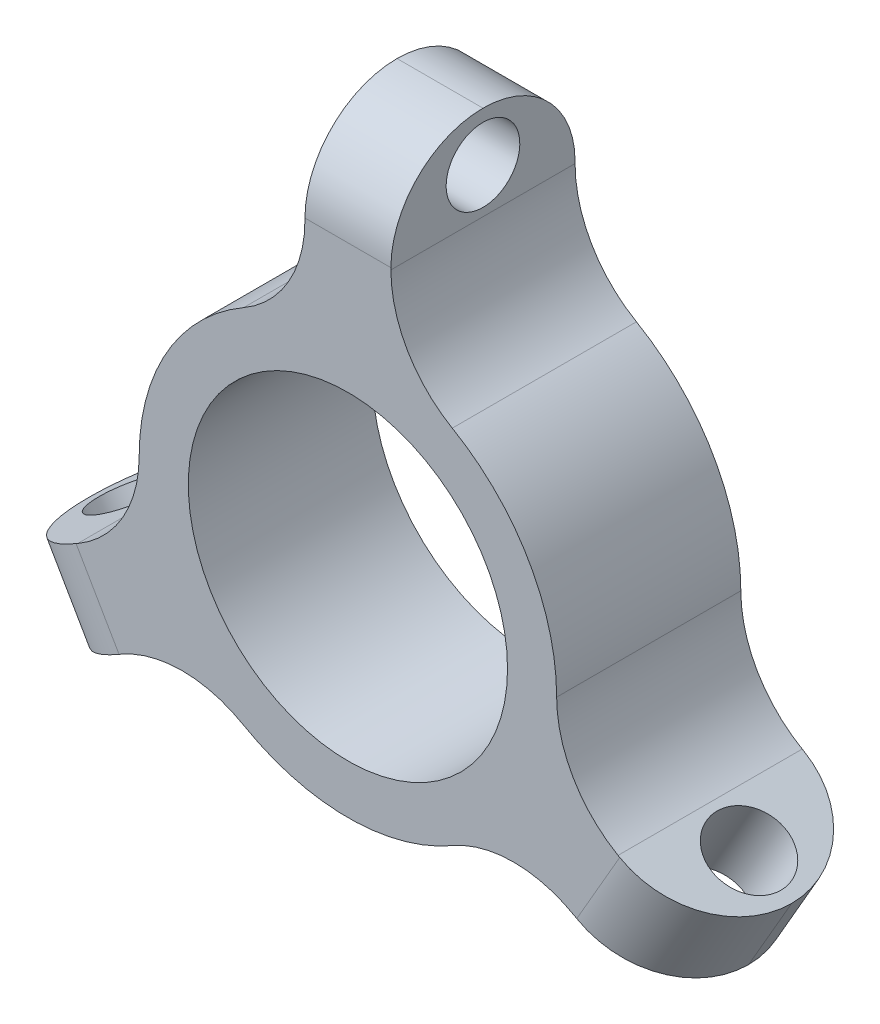
ISO-10303-21;
HEADER;
FILE_DESCRIPTION(('STEP AP214'),'2;1');
FILE_NAME('part.step','',(''),(''),'','','');
FILE_SCHEMA(('AUTOMOTIVE_DESIGN { 1 0 10303 214 1 1 1 1 }'));
ENDSEC;
DATA;
#1=APPLICATION_CONTEXT('core data for automotive mechanical design processes');
#2=APPLICATION_PROTOCOL_DEFINITION('international standard','automotive_design',2000,#1);
#3=PRODUCT_CONTEXT('',#1,'mechanical');
#4=PRODUCT('Part','Part','',(#3));
#5=PRODUCT_RELATED_PRODUCT_CATEGORY('part','',(#4));
#6=PRODUCT_DEFINITION_FORMATION('','',#4);
#7=PRODUCT_DEFINITION_CONTEXT('part definition',#1,'design');
#8=PRODUCT_DEFINITION('design','',#6,#7);
#9=PRODUCT_DEFINITION_SHAPE('','',#8);
#10=(LENGTH_UNIT() NAMED_UNIT(*) SI_UNIT(.MILLI.,.METRE.));
#11=(NAMED_UNIT(*) PLANE_ANGLE_UNIT() SI_UNIT($,.RADIAN.));
#12=(NAMED_UNIT(*) SI_UNIT($,.STERADIAN.) SOLID_ANGLE_UNIT());
#13=UNCERTAINTY_MEASURE_WITH_UNIT(LENGTH_MEASURE(1.E-05),#10,'distance_accuracy_value','');
#14=(GEOMETRIC_REPRESENTATION_CONTEXT(3) GLOBAL_UNCERTAINTY_ASSIGNED_CONTEXT((#13)) GLOBAL_UNIT_ASSIGNED_CONTEXT((#10,
#11,#12)) REPRESENTATION_CONTEXT('',''));
#15=CARTESIAN_POINT('',(0.,0.,0.));
#16=DIRECTION('',(0.,0.,1.));
#17=DIRECTION('',(1.,0.,0.));
#18=AXIS2_PLACEMENT_3D('',#15,#16,#17);
#19=CARTESIAN_POINT('',(-13.5,-23.3826859021798,15.));
#20=DIRECTION('',(0.,0.,1.));
#21=DIRECTION('',(1.,0.,0.));
#22=AXIS2_PLACEMENT_3D('',#19,#20,#21);
#23=PLANE('',#22);
#24=DIRECTION('',(-0.866025403784438,-0.5,0.));
#25=VECTOR('',#24,1.);
#26=CARTESIAN_POINT('',(-28.6324761614891,-12.4895159350739,15.));
#27=LINE('',#26,#25);
#28=CARTESIAN_POINT('',(-22.,-8.66025403784439,15.));
#29=VERTEX_POINT('',#28);
#30=CARTESIAN_POINT('',(-22.1372856331058,-8.73951593507389,15.));
#31=VERTEX_POINT('',#30);
#32=EDGE_CURVE('E259',#29,#31,#27,.T.);
#33=ORIENTED_EDGE('',*,*,#32,.T.);
#34=DIRECTION('',(0.5,-0.866025403784438,0.));
#35=VECTOR('',#34,1.);
#36=CARTESIAN_POINT('',(-18.6372856331058,-14.801693761565,15.));
#37=LINE('',#36,#35);
#38=CARTESIAN_POINT('',(-18.6372856331058,-14.801693761565,15.));
#39=VERTEX_POINT('',#38);
#40=EDGE_CURVE('E247',#31,#39,#37,.T.);
#41=ORIENTED_EDGE('',*,*,#40,.T.);
#42=DIRECTION('',(0.866025403784439,0.5,0.));
#43=VECTOR('',#42,1.);
#44=CARTESIAN_POINT('',(-18.5,-14.7224318643355,15.));
#45=LINE('',#44,#43);
#46=CARTESIAN_POINT('',(-18.5,-14.7224318643355,15.));
#47=VERTEX_POINT('',#46);
#48=EDGE_CURVE('E203',#39,#47,#45,.T.);
#49=ORIENTED_EDGE('',*,*,#48,.T.);
#50=CARTESIAN_POINT('',(-13.5,-23.3826859021798,15.));
#51=DIRECTION('',(0.,0.,-1.));
#52=DIRECTION('',(1.,0.,0.));
#53=AXIS2_PLACEMENT_3D('',#50,#51,#52);
#54=CIRCLE('',#53,10.);
#55=CARTESIAN_POINT('',(-8.49999999999999,-14.7224318643355,15.));
#56=VERTEX_POINT('',#55);
#57=EDGE_CURVE('E191',#47,#56,#54,.T.);
#58=ORIENTED_EDGE('',*,*,#57,.T.);
#59=CARTESIAN_POINT('',(0.,0.,15.));
#60=DIRECTION('',(0.,0.,1.));
#61=DIRECTION('',(1.,0.,0.));
#62=AXIS2_PLACEMENT_3D('',#59,#60,#61);
#63=CIRCLE('',#62,17.);
#64=CARTESIAN_POINT('',(8.49999999999999,-14.7224318643355,15.));
#65=VERTEX_POINT('',#64);
#66=EDGE_CURVE('E181',#56,#65,#63,.T.);
#67=ORIENTED_EDGE('',*,*,#66,.T.);
#68=CARTESIAN_POINT('',(13.5,-23.3826859021798,15.));
#69=DIRECTION('',(0.,0.,-1.));
#70=DIRECTION('',(1.,0.,0.));
#71=AXIS2_PLACEMENT_3D('',#68,#69,#70);
#72=CIRCLE('',#71,10.);
#73=CARTESIAN_POINT('',(18.5,-14.7224318643355,15.));
#74=VERTEX_POINT('',#73);
#75=EDGE_CURVE('E195',#65,#74,#72,.T.);
#76=ORIENTED_EDGE('',*,*,#75,.T.);
#77=DIRECTION('',(0.866025403784439,-0.5,0.));
#78=VECTOR('',#77,1.);
#79=CARTESIAN_POINT('',(25.1324761614891,-18.5516937615649,15.));
#80=LINE('',#79,#78);
#81=CARTESIAN_POINT('',(18.6372856331058,-14.8016937615649,15.));
#82=VERTEX_POINT('',#81);
#83=EDGE_CURVE('E286',#74,#82,#80,.T.);
#84=ORIENTED_EDGE('',*,*,#83,.T.);
#85=DIRECTION('',(0.5,0.866025403784439,0.));
#86=VECTOR('',#85,1.);
#87=CARTESIAN_POINT('',(22.1372856331058,-8.73951593507386,15.));
#88=LINE('',#87,#86);
#89=CARTESIAN_POINT('',(22.1372856331058,-8.73951593507386,15.));
#90=VERTEX_POINT('',#89);
#91=EDGE_CURVE('E243',#82,#90,#88,.T.);
#92=ORIENTED_EDGE('',*,*,#91,.T.);
#93=DIRECTION('',(-0.866025403784439,0.5,0.));
#94=VECTOR('',#93,1.);
#95=CARTESIAN_POINT('',(22.,-8.66025403784438,15.));
#96=LINE('',#95,#94);
#97=CARTESIAN_POINT('',(22.,-8.66025403784438,15.));
#98=VERTEX_POINT('',#97);
#99=EDGE_CURVE('E295',#90,#98,#96,.T.);
#100=ORIENTED_EDGE('',*,*,#99,.T.);
#101=CARTESIAN_POINT('',(27.,0.,15.));
#102=DIRECTION('',(0.,0.,-1.));
#103=DIRECTION('',(1.,0.,0.));
#104=AXIS2_PLACEMENT_3D('',#101,#102,#103);
#105=CIRCLE('',#104,10.);
#106=CARTESIAN_POINT('',(17.,0.,15.));
#107=VERTEX_POINT('',#106);
#108=EDGE_CURVE('E294',#98,#107,#105,.T.);
#109=ORIENTED_EDGE('',*,*,#108,.T.);
#110=CARTESIAN_POINT('',(0.,0.,15.));
#111=DIRECTION('',(0.,0.,1.));
#112=DIRECTION('',(1.,0.,0.));
#113=AXIS2_PLACEMENT_3D('',#110,#111,#112);
#114=CIRCLE('',#113,17.);
#115=CARTESIAN_POINT('',(8.5,14.7224318643355,15.));
#116=VERTEX_POINT('',#115);
#117=EDGE_CURVE('E296',#107,#116,#114,.T.);
#118=ORIENTED_EDGE('',*,*,#117,.T.);
#119=CARTESIAN_POINT('',(13.5,23.3826859021798,15.));
#120=DIRECTION('',(0.,0.,-1.));
#121=DIRECTION('',(1.,0.,0.));
#122=AXIS2_PLACEMENT_3D('',#119,#120,#121);
#123=CIRCLE('',#122,10.);
#124=CARTESIAN_POINT('',(3.5,23.3826859021798,15.));
#125=VERTEX_POINT('',#124);
#126=EDGE_CURVE('E299',#116,#125,#123,.T.);
#127=ORIENTED_EDGE('',*,*,#126,.T.);
#128=DIRECTION('',(0.,1.,0.));
#129=VECTOR('',#128,1.);
#130=CARTESIAN_POINT('',(3.5,31.0412096966388,15.));
#131=LINE('',#130,#129);
#132=CARTESIAN_POINT('',(3.5,23.5412096966388,15.));
#133=VERTEX_POINT('',#132);
#134=EDGE_CURVE('E300',#125,#133,#131,.T.);
#135=ORIENTED_EDGE('',*,*,#134,.T.);
#136=DIRECTION('',(-1.,0.,0.));
#137=VECTOR('',#136,1.);
#138=CARTESIAN_POINT('',(-3.5,23.5412096966388,15.));
#139=LINE('',#138,#137);
#140=CARTESIAN_POINT('',(-3.5,23.5412096966388,15.));
#141=VERTEX_POINT('',#140);
#142=EDGE_CURVE('E226',#133,#141,#139,.T.);
#143=ORIENTED_EDGE('',*,*,#142,.T.);
#144=DIRECTION('',(0.,-1.,0.));
#145=VECTOR('',#144,1.);
#146=CARTESIAN_POINT('',(-3.5,23.3826859021798,15.));
#147=LINE('',#146,#145);
#148=CARTESIAN_POINT('',(-3.5,23.3826859021798,15.));
#149=VERTEX_POINT('',#148);
#150=EDGE_CURVE('E305',#141,#149,#147,.T.);
#151=ORIENTED_EDGE('',*,*,#150,.T.);
#152=CARTESIAN_POINT('',(-13.5,23.3826859021798,15.));
#153=DIRECTION('',(0.,0.,-1.));
#154=DIRECTION('',(1.,0.,0.));
#155=AXIS2_PLACEMENT_3D('',#152,#153,#154);
#156=CIRCLE('',#155,10.);
#157=CARTESIAN_POINT('',(-8.5,14.7224318643355,15.));
#158=VERTEX_POINT('',#157);
#159=EDGE_CURVE('E303',#149,#158,#156,.T.);
#160=ORIENTED_EDGE('',*,*,#159,.T.);
#161=CARTESIAN_POINT('',(0.,0.,15.));
#162=DIRECTION('',(0.,0.,1.));
#163=DIRECTION('',(1.,0.,0.));
#164=AXIS2_PLACEMENT_3D('',#161,#162,#163);
#165=CIRCLE('',#164,17.);
#166=CARTESIAN_POINT('',(-17.,0.,15.));
#167=VERTEX_POINT('',#166);
#168=EDGE_CURVE('E307',#158,#167,#165,.T.);
#169=ORIENTED_EDGE('',*,*,#168,.T.);
#170=CARTESIAN_POINT('',(-27.,0.,15.));
#171=DIRECTION('',(0.,0.,-1.));
#172=DIRECTION('',(-1.,0.,0.));
#173=AXIS2_PLACEMENT_3D('',#170,#171,#172);
#174=CIRCLE('',#173,10.);
#175=EDGE_CURVE('E262',#167,#29,#174,.T.);
#176=ORIENTED_EDGE('',*,*,#175,.T.);
#177=EDGE_LOOP('',(#33,#41,#49,#58,#67,#76,#84,#92,#100,#109,#118,#127,#135,#143,#151,#160,#169,#176));
#178=FACE_BOUND('',#177,.T.);
#179=CARTESIAN_POINT('',(0.,0.,15.));
#180=DIRECTION('',(0.,0.,1.));
#181=DIRECTION('',(1.,0.,0.));
#182=AXIS2_PLACEMENT_3D('',#179,#180,#181);
#183=CIRCLE('',#182,13.);
#184=CARTESIAN_POINT('',(13.,0.,15.));
#185=VERTEX_POINT('',#184);
#186=EDGE_CURVE('E284',#185,#185,#183,.T.);
#187=ORIENTED_EDGE('',*,*,#186,.F.);
#188=EDGE_LOOP('',(#187));
#189=FACE_BOUND('',#188,.T.);
#190=ADVANCED_FACE('F39',(#178,#189),#23,.T.);
#191=CARTESIAN_POINT('',(-13.5,-23.3826859021798,0.));
#192=DIRECTION('',(0.,0.,1.));
#193=DIRECTION('',(1.,0.,0.));
#194=AXIS2_PLACEMENT_3D('',#191,#192,#193);
#195=PLANE('',#194);
#196=DIRECTION('',(0.866025403784439,0.5,0.));
#197=VECTOR('',#196,1.);
#198=CARTESIAN_POINT('',(-18.5,-14.7224318643355,0.));
#199=LINE('',#198,#197);
#200=CARTESIAN_POINT('',(-18.6372856331058,-14.801693761565,0.));
#201=VERTEX_POINT('',#200);
#202=CARTESIAN_POINT('',(-18.5,-14.7224318643355,0.));
#203=VERTEX_POINT('',#202);
#204=EDGE_CURVE('E202',#201,#203,#199,.T.);
#205=ORIENTED_EDGE('',*,*,#204,.F.);
#206=DIRECTION('',(0.5,-0.866025403784438,0.));
#207=VECTOR('',#206,1.);
#208=CARTESIAN_POINT('',(-13.6372856331058,-23.4619477994093,0.));
#209=LINE('',#208,#207);
#210=CARTESIAN_POINT('',(-22.1372856331058,-8.73951593507389,0.));
#211=VERTEX_POINT('',#210);
#212=EDGE_CURVE('E11',#201,#211,#209,.F.);
#213=ORIENTED_EDGE('',*,*,#212,.T.);
#214=DIRECTION('',(-0.866025403784438,-0.5,0.));
#215=VECTOR('',#214,1.);
#216=CARTESIAN_POINT('',(-28.6324761614891,-12.4895159350739,0.));
#217=LINE('',#216,#215);
#218=CARTESIAN_POINT('',(-22.,-8.66025403784439,0.));
#219=VERTEX_POINT('',#218);
#220=EDGE_CURVE('E338',#219,#211,#217,.T.);
#221=ORIENTED_EDGE('',*,*,#220,.F.);
#222=CARTESIAN_POINT('',(-27.,0.,0.));
#223=DIRECTION('',(0.,0.,-1.));
#224=DIRECTION('',(-1.,0.,0.));
#225=AXIS2_PLACEMENT_3D('',#222,#223,#224);
#226=CIRCLE('',#225,10.);
#227=CARTESIAN_POINT('',(-17.,0.,0.));
#228=VERTEX_POINT('',#227);
#229=EDGE_CURVE('E337',#228,#219,#226,.T.);
#230=ORIENTED_EDGE('',*,*,#229,.F.);
#231=CARTESIAN_POINT('',(0.,0.,0.));
#232=DIRECTION('',(0.,0.,1.));
#233=DIRECTION('',(1.,0.,0.));
#234=AXIS2_PLACEMENT_3D('',#231,#232,#233);
#235=CIRCLE('',#234,17.);
#236=CARTESIAN_POINT('',(-8.5,14.7224318643355,0.));
#237=VERTEX_POINT('',#236);
#238=EDGE_CURVE('E333',#237,#228,#235,.T.);
#239=ORIENTED_EDGE('',*,*,#238,.F.);
#240=CARTESIAN_POINT('',(-13.5,23.3826859021798,0.));
#241=DIRECTION('',(0.,0.,-1.));
#242=DIRECTION('',(1.,0.,0.));
#243=AXIS2_PLACEMENT_3D('',#240,#241,#242);
#244=CIRCLE('',#243,10.);
#245=CARTESIAN_POINT('',(-3.5,23.3826859021798,0.));
#246=VERTEX_POINT('',#245);
#247=EDGE_CURVE('E334',#246,#237,#244,.T.);
#248=ORIENTED_EDGE('',*,*,#247,.F.);
#249=DIRECTION('',(0.,-1.,0.));
#250=VECTOR('',#249,1.);
#251=CARTESIAN_POINT('',(-3.5,23.3826859021798,0.));
#252=LINE('',#251,#250);
#253=CARTESIAN_POINT('',(-3.5,23.5412096966388,0.));
#254=VERTEX_POINT('',#253);
#255=EDGE_CURVE('E332',#254,#246,#252,.T.);
#256=ORIENTED_EDGE('',*,*,#255,.F.);
#257=DIRECTION('',(-1.,0.,0.));
#258=VECTOR('',#257,1.);
#259=CARTESIAN_POINT('',(-13.5,23.5412096966388,0.));
#260=LINE('',#259,#258);
#261=CARTESIAN_POINT('',(3.5,23.5412096966388,0.));
#262=VERTEX_POINT('',#261);
#263=EDGE_CURVE('E218',#254,#262,#260,.F.);
#264=ORIENTED_EDGE('',*,*,#263,.T.);
#265=DIRECTION('',(0.,1.,0.));
#266=VECTOR('',#265,1.);
#267=CARTESIAN_POINT('',(3.5,31.0412096966388,0.));
#268=LINE('',#267,#266);
#269=CARTESIAN_POINT('',(3.5,23.3826859021798,0.));
#270=VERTEX_POINT('',#269);
#271=EDGE_CURVE('E327',#270,#262,#268,.T.);
#272=ORIENTED_EDGE('',*,*,#271,.F.);
#273=CARTESIAN_POINT('',(13.5,23.3826859021798,0.));
#274=DIRECTION('',(0.,0.,-1.));
#275=DIRECTION('',(1.,0.,0.));
#276=AXIS2_PLACEMENT_3D('',#273,#274,#275);
#277=CIRCLE('',#276,10.);
#278=CARTESIAN_POINT('',(8.5,14.7224318643355,0.));
#279=VERTEX_POINT('',#278);
#280=EDGE_CURVE('E326',#279,#270,#277,.T.);
#281=ORIENTED_EDGE('',*,*,#280,.F.);
#282=CARTESIAN_POINT('',(0.,0.,0.));
#283=DIRECTION('',(0.,0.,1.));
#284=DIRECTION('',(1.,0.,0.));
#285=AXIS2_PLACEMENT_3D('',#282,#283,#284);
#286=CIRCLE('',#285,17.);
#287=CARTESIAN_POINT('',(17.,0.,0.));
#288=VERTEX_POINT('',#287);
#289=EDGE_CURVE('E322',#288,#279,#286,.T.);
#290=ORIENTED_EDGE('',*,*,#289,.F.);
#291=CARTESIAN_POINT('',(27.,0.,0.));
#292=DIRECTION('',(0.,0.,-1.));
#293=DIRECTION('',(1.,0.,0.));
#294=AXIS2_PLACEMENT_3D('',#291,#292,#293);
#295=CIRCLE('',#294,10.);
#296=CARTESIAN_POINT('',(22.,-8.66025403784438,0.));
#297=VERTEX_POINT('',#296);
#298=EDGE_CURVE('E325',#297,#288,#295,.T.);
#299=ORIENTED_EDGE('',*,*,#298,.F.);
#300=DIRECTION('',(-0.866025403784439,0.5,0.));
#301=VECTOR('',#300,1.);
#302=CARTESIAN_POINT('',(22.,-8.66025403784438,0.));
#303=LINE('',#302,#301);
#304=CARTESIAN_POINT('',(22.1372856331058,-8.73951593507387,0.));
#305=VERTEX_POINT('',#304);
#306=EDGE_CURVE('E319',#305,#297,#303,.T.);
#307=ORIENTED_EDGE('',*,*,#306,.F.);
#308=DIRECTION('',(0.5,0.866025403784439,0.));
#309=VECTOR('',#308,1.);
#310=CARTESIAN_POINT('',(6.8872856331058,-35.1532907504993,0.));
#311=LINE('',#310,#309);
#312=CARTESIAN_POINT('',(18.6372856331058,-14.8016937615649,0.));
#313=VERTEX_POINT('',#312);
#314=EDGE_CURVE('E240',#305,#313,#311,.F.);
#315=ORIENTED_EDGE('',*,*,#314,.T.);
#316=DIRECTION('',(0.866025403784439,-0.5,0.));
#317=VECTOR('',#316,1.);
#318=CARTESIAN_POINT('',(25.1324761614891,-18.5516937615649,0.));
#319=LINE('',#318,#317);
#320=CARTESIAN_POINT('',(18.5,-14.7224318643355,0.));
#321=VERTEX_POINT('',#320);
#322=EDGE_CURVE('E320',#321,#313,#319,.T.);
#323=ORIENTED_EDGE('',*,*,#322,.F.);
#324=CARTESIAN_POINT('',(13.5,-23.3826859021798,0.));
#325=DIRECTION('',(0.,0.,-1.));
#326=DIRECTION('',(1.,0.,0.));
#327=AXIS2_PLACEMENT_3D('',#324,#325,#326);
#328=CIRCLE('',#327,10.);
#329=CARTESIAN_POINT('',(8.49999999999999,-14.7224318643355,0.));
#330=VERTEX_POINT('',#329);
#331=EDGE_CURVE('E312',#330,#321,#328,.T.);
#332=ORIENTED_EDGE('',*,*,#331,.F.);
#333=CARTESIAN_POINT('',(0.,0.,0.));
#334=DIRECTION('',(0.,0.,1.));
#335=DIRECTION('',(1.,0.,0.));
#336=AXIS2_PLACEMENT_3D('',#333,#334,#335);
#337=CIRCLE('',#336,17.);
#338=CARTESIAN_POINT('',(-8.49999999999999,-14.7224318643355,0.));
#339=VERTEX_POINT('',#338);
#340=EDGE_CURVE('E311',#339,#330,#337,.T.);
#341=ORIENTED_EDGE('',*,*,#340,.F.);
#342=CARTESIAN_POINT('',(-13.5,-23.3826859021798,0.));
#343=DIRECTION('',(0.,0.,-1.));
#344=DIRECTION('',(1.,0.,0.));
#345=AXIS2_PLACEMENT_3D('',#342,#343,#344);
#346=CIRCLE('',#345,10.);
#347=EDGE_CURVE('E207',#203,#339,#346,.T.);
#348=ORIENTED_EDGE('',*,*,#347,.F.);
#349=EDGE_LOOP('',(#205,#213,#221,#230,#239,#248,#256,#264,#272,#281,#290,#299,#307,#315,#323,
#332,#341,#348));
#350=FACE_BOUND('',#349,.T.);
#351=CARTESIAN_POINT('',(0.,0.,0.));
#352=DIRECTION('',(0.,0.,1.));
#353=DIRECTION('',(1.,0.,0.));
#354=AXIS2_PLACEMENT_3D('',#351,#352,#353);
#355=CIRCLE('',#354,13.);
#356=CARTESIAN_POINT('',(13.,0.,0.));
#357=VERTEX_POINT('',#356);
#358=EDGE_CURVE('E234',#357,#357,#355,.T.);
#359=ORIENTED_EDGE('',*,*,#358,.T.);
#360=EDGE_LOOP('',(#359));
#361=FACE_BOUND('',#360,.T.);
#362=ADVANCED_FACE('F373',(#350,#361),#195,.F.);
#363=CARTESIAN_POINT('',(-13.5,-23.3826859021798,15.));
#364=DIRECTION('',(0.,0.,-1.));
#365=DIRECTION('',(-1.,0.,0.));
#366=AXIS2_PLACEMENT_3D('',#363,#364,#365);
#367=CYLINDRICAL_SURFACE('',#366,10.);
#368=ORIENTED_EDGE('',*,*,#347,.T.);
#369=DIRECTION('',(0.,0.,-1.));
#370=VECTOR('',#369,1.);
#371=CARTESIAN_POINT('',(-8.49999999999999,-14.7224318643355,15.));
#372=LINE('',#371,#370);
#373=EDGE_CURVE('E187',#56,#339,#372,.T.);
#374=ORIENTED_EDGE('',*,*,#373,.F.);
#375=ORIENTED_EDGE('',*,*,#57,.F.);
#376=DIRECTION('',(0.,0.,-1.));
#377=VECTOR('',#376,1.);
#378=CARTESIAN_POINT('',(-18.5,-14.7224318643355,15.));
#379=LINE('',#378,#377);
#380=EDGE_CURVE('E313',#47,#203,#379,.T.);
#381=ORIENTED_EDGE('',*,*,#380,.T.);
#382=EDGE_LOOP('',(#368,#374,#375,#381));
#383=FACE_BOUND('',#382,.T.);
#384=ADVANCED_FACE('F210',(#383),#367,.F.);
#385=CARTESIAN_POINT('',(0.,0.,15.));
#386=DIRECTION('',(0.,0.,-1.));
#387=DIRECTION('',(-1.,0.,0.));
#388=AXIS2_PLACEMENT_3D('',#385,#386,#387);
#389=CYLINDRICAL_SURFACE('',#388,17.);
#390=ORIENTED_EDGE('',*,*,#340,.T.);
#391=DIRECTION('',(0.,0.,-1.));
#392=VECTOR('',#391,1.);
#393=CARTESIAN_POINT('',(8.49999999999999,-14.7224318643355,15.));
#394=LINE('',#393,#392);
#395=EDGE_CURVE('E190',#65,#330,#394,.T.);
#396=ORIENTED_EDGE('',*,*,#395,.F.);
#397=ORIENTED_EDGE('',*,*,#66,.F.);
#398=ORIENTED_EDGE('',*,*,#373,.T.);
#399=EDGE_LOOP('',(#390,#396,#397,#398));
#400=FACE_BOUND('',#399,.T.);
#401=ADVANCED_FACE('F183',(#400),#389,.T.);
#402=CARTESIAN_POINT('',(13.5,-23.3826859021798,15.));
#403=DIRECTION('',(0.,0.,-1.));
#404=DIRECTION('',(-1.,0.,0.));
#405=AXIS2_PLACEMENT_3D('',#402,#403,#404);
#406=CYLINDRICAL_SURFACE('',#405,10.);
#407=ORIENTED_EDGE('',*,*,#331,.T.);
#408=DIRECTION('',(0.,0.,-1.));
#409=VECTOR('',#408,1.);
#410=CARTESIAN_POINT('',(18.5,-14.7224318643355,15.));
#411=LINE('',#410,#409);
#412=EDGE_CURVE('E212',#74,#321,#411,.T.);
#413=ORIENTED_EDGE('',*,*,#412,.F.);
#414=ORIENTED_EDGE('',*,*,#75,.F.);
#415=ORIENTED_EDGE('',*,*,#395,.T.);
#416=EDGE_LOOP('',(#407,#413,#414,#415));
#417=FACE_BOUND('',#416,.T.);
#418=ADVANCED_FACE('F486',(#417),#406,.F.);
#419=CARTESIAN_POINT('',(25.1324761614891,-18.5516937615649,15.));
#420=DIRECTION('',(0.5,0.866025403784439,0.));
#421=DIRECTION('',(-0.866025403784439,0.5,0.));
#422=AXIS2_PLACEMENT_3D('',#419,#420,#421);
#423=PLANE('',#422);
#424=CARTESIAN_POINT('',(21.6683745463513,-16.5516937615649,7.5));
#425=DIRECTION('',(-0.5,-0.866025403784439,0.));
#426=DIRECTION('',(0.866025403784439,-0.5,0.));
#427=AXIS2_PLACEMENT_3D('',#424,#425,#426);
#428=CIRCLE('',#427,2.99999999999999);
#429=CARTESIAN_POINT('',(24.2664507577046,-18.0516937615649,7.5));
#430=VERTEX_POINT('',#429);
#431=EDGE_CURVE('E273',#430,#430,#428,.T.);
#432=ORIENTED_EDGE('',*,*,#431,.F.);
#433=EDGE_LOOP('',(#432));
#434=FACE_BOUND('',#433,.T.);
#435=ORIENTED_EDGE('',*,*,#322,.T.);
#436=CARTESIAN_POINT('',(18.6372856331058,-14.8016937615649,7.5));
#437=DIRECTION('',(0.5,0.866025403784439,0.));
#438=DIRECTION('',(-0.866025403784439,0.5,0.));
#439=AXIS2_PLACEMENT_3D('',#436,#437,#438);
#440=CIRCLE('',#439,7.5);
#441=CARTESIAN_POINT('',(25.1324761614891,-18.5516937615649,7.5));
#442=VERTEX_POINT('',#441);
#443=EDGE_CURVE('E242',#313,#442,#440,.F.);
#444=ORIENTED_EDGE('',*,*,#443,.T.);
#445=CARTESIAN_POINT('',(18.6372856331058,-14.8016937615649,7.5));
#446=DIRECTION('',(0.5,0.866025403784439,0.));
#447=DIRECTION('',(-0.866025403784439,0.5,0.));
#448=AXIS2_PLACEMENT_3D('',#445,#446,#447);
#449=CIRCLE('',#448,7.5);
#450=EDGE_CURVE('E238',#442,#82,#449,.F.);
#451=ORIENTED_EDGE('',*,*,#450,.T.);
#452=ORIENTED_EDGE('',*,*,#83,.F.);
#453=ORIENTED_EDGE('',*,*,#412,.T.);
#454=EDGE_LOOP('',(#435,#444,#451,#452,#453));
#455=FACE_BOUND('',#454,.T.);
#456=ADVANCED_FACE('F367',(#434,#455),#423,.F.);
#457=CARTESIAN_POINT('',(22.,-8.66025403784438,15.));
#458=DIRECTION('',(-0.5,-0.866025403784439,0.));
#459=DIRECTION('',(0.866025403784439,-0.5,0.));
#460=AXIS2_PLACEMENT_3D('',#457,#458,#459);
#461=PLANE('',#460);
#462=CARTESIAN_POINT('',(25.1683745463513,-10.4895159350739,7.5));
#463=DIRECTION('',(-0.5,-0.866025403784439,0.));
#464=DIRECTION('',(0.866025403784439,-0.5,0.));
#465=AXIS2_PLACEMENT_3D('',#462,#463,#464);
#466=CIRCLE('',#465,2.99999999999999);
#467=CARTESIAN_POINT('',(27.7664507577046,-11.9895159350739,7.5));
#468=VERTEX_POINT('',#467);
#469=EDGE_CURVE('E275',#468,#468,#466,.F.);
#470=ORIENTED_EDGE('',*,*,#469,.F.);
#471=EDGE_LOOP('',(#470));
#472=FACE_BOUND('',#471,.T.);
#473=CARTESIAN_POINT('',(22.1372856331058,-8.73951593507386,7.5));
#474=DIRECTION('',(-0.5,-0.866025403784439,0.));
#475=DIRECTION('',(0.866025403784439,-0.5,0.));
#476=AXIS2_PLACEMENT_3D('',#473,#474,#475);
#477=CIRCLE('',#476,7.5);
#478=CARTESIAN_POINT('',(28.6324761614891,-12.4895159350739,7.5));
#479=VERTEX_POINT('',#478);
#480=EDGE_CURVE('E229',#90,#479,#477,.F.);
#481=ORIENTED_EDGE('',*,*,#480,.T.);
#482=CARTESIAN_POINT('',(22.1372856331058,-8.73951593507387,7.5));
#483=DIRECTION('',(-0.5,-0.866025403784439,0.));
#484=DIRECTION('',(0.866025403784439,-0.5,0.));
#485=AXIS2_PLACEMENT_3D('',#482,#483,#484);
#486=CIRCLE('',#485,7.5);
#487=EDGE_CURVE('E233',#479,#305,#486,.F.);
#488=ORIENTED_EDGE('',*,*,#487,.T.);
#489=ORIENTED_EDGE('',*,*,#306,.T.);
#490=DIRECTION('',(0.,0.,-1.));
#491=VECTOR('',#490,1.);
#492=CARTESIAN_POINT('',(22.,-8.66025403784438,15.));
#493=LINE('',#492,#491);
#494=EDGE_CURVE('E361',#98,#297,#493,.T.);
#495=ORIENTED_EDGE('',*,*,#494,.F.);
#496=ORIENTED_EDGE('',*,*,#99,.F.);
#497=EDGE_LOOP('',(#481,#488,#489,#495,#496));
#498=FACE_BOUND('',#497,.T.);
#499=ADVANCED_FACE('F388',(#472,#498),#461,.F.);
#500=CARTESIAN_POINT('',(27.,0.,15.));
#501=DIRECTION('',(0.,0.,-1.));
#502=DIRECTION('',(-1.,0.,0.));
#503=AXIS2_PLACEMENT_3D('',#500,#501,#502);
#504=CYLINDRICAL_SURFACE('',#503,10.);
#505=ORIENTED_EDGE('',*,*,#298,.T.);
#506=DIRECTION('',(0.,0.,-1.));
#507=VECTOR('',#506,1.);
#508=CARTESIAN_POINT('',(17.,0.,15.));
#509=LINE('',#508,#507);
#510=EDGE_CURVE('E358',#107,#288,#509,.T.);
#511=ORIENTED_EDGE('',*,*,#510,.F.);
#512=ORIENTED_EDGE('',*,*,#108,.F.);
#513=ORIENTED_EDGE('',*,*,#494,.T.);
#514=EDGE_LOOP('',(#505,#511,#512,#513));
#515=FACE_BOUND('',#514,.T.);
#516=ADVANCED_FACE('F393',(#515),#504,.F.);
#517=CARTESIAN_POINT('',(0.,0.,15.));
#518=DIRECTION('',(0.,0.,-1.));
#519=DIRECTION('',(-1.,0.,0.));
#520=AXIS2_PLACEMENT_3D('',#517,#518,#519);
#521=CYLINDRICAL_SURFACE('',#520,17.);
#522=ORIENTED_EDGE('',*,*,#289,.T.);
#523=DIRECTION('',(0.,0.,-1.));
#524=VECTOR('',#523,1.);
#525=CARTESIAN_POINT('',(8.5,14.7224318643355,15.));
#526=LINE('',#525,#524);
#527=EDGE_CURVE('E359',#116,#279,#526,.T.);
#528=ORIENTED_EDGE('',*,*,#527,.F.);
#529=ORIENTED_EDGE('',*,*,#117,.F.);
#530=ORIENTED_EDGE('',*,*,#510,.T.);
#531=EDGE_LOOP('',(#522,#528,#529,#530));
#532=FACE_BOUND('',#531,.T.);
#533=ADVANCED_FACE('F398',(#532),#521,.T.);
#534=CARTESIAN_POINT('',(13.5,23.3826859021798,15.));
#535=DIRECTION('',(0.,0.,-1.));
#536=DIRECTION('',(-1.,0.,0.));
#537=AXIS2_PLACEMENT_3D('',#534,#535,#536);
#538=CYLINDRICAL_SURFACE('',#537,10.);
#539=ORIENTED_EDGE('',*,*,#280,.T.);
#540=DIRECTION('',(0.,0.,-1.));
#541=VECTOR('',#540,1.);
#542=CARTESIAN_POINT('',(3.5,23.3826859021798,15.));
#543=LINE('',#542,#541);
#544=EDGE_CURVE('E353',#125,#270,#543,.T.);
#545=ORIENTED_EDGE('',*,*,#544,.F.);
#546=ORIENTED_EDGE('',*,*,#126,.F.);
#547=ORIENTED_EDGE('',*,*,#527,.T.);
#548=EDGE_LOOP('',(#539,#545,#546,#547));
#549=FACE_BOUND('',#548,.T.);
#550=ADVANCED_FACE('F404',(#549),#538,.F.);
#551=CARTESIAN_POINT('',(3.5,31.0412096966388,15.));
#552=DIRECTION('',(-1.,0.,0.));
#553=DIRECTION('',(0.,-1.,0.));
#554=AXIS2_PLACEMENT_3D('',#551,#552,#553);
#555=PLANE('',#554);
#556=CARTESIAN_POINT('',(3.50000000000024,27.0412096966388,7.5));
#557=DIRECTION('',(1.,0.,0.));
#558=DIRECTION('',(0.,1.,0.));
#559=AXIS2_PLACEMENT_3D('',#556,#557,#558);
#560=CIRCLE('',#559,2.99999999999999);
#561=CARTESIAN_POINT('',(3.50000000000027,30.0412096966388,7.5));
#562=VERTEX_POINT('',#561);
#563=EDGE_CURVE('E595',#562,#562,#560,.T.);
#564=ORIENTED_EDGE('',*,*,#563,.F.);
#565=EDGE_LOOP('',(#564));
#566=FACE_BOUND('',#565,.T.);
#567=ORIENTED_EDGE('',*,*,#271,.T.);
#568=CARTESIAN_POINT('',(3.5,23.5412096966388,7.5));
#569=DIRECTION('',(-1.,0.,0.));
#570=DIRECTION('',(0.,-1.,0.));
#571=AXIS2_PLACEMENT_3D('',#568,#569,#570);
#572=CIRCLE('',#571,7.5);
#573=CARTESIAN_POINT('',(3.5,31.0412096966388,7.5));
#574=VERTEX_POINT('',#573);
#575=EDGE_CURVE('E221',#262,#574,#572,.F.);
#576=ORIENTED_EDGE('',*,*,#575,.T.);
#577=CARTESIAN_POINT('',(3.5,23.5412096966388,7.5));
#578=DIRECTION('',(-1.,0.,0.));
#579=DIRECTION('',(0.,-1.,0.));
#580=AXIS2_PLACEMENT_3D('',#577,#578,#579);
#581=CIRCLE('',#580,7.5);
#582=EDGE_CURVE('E225',#574,#133,#581,.F.);
#583=ORIENTED_EDGE('',*,*,#582,.T.);
#584=ORIENTED_EDGE('',*,*,#134,.F.);
#585=ORIENTED_EDGE('',*,*,#544,.T.);
#586=EDGE_LOOP('',(#567,#576,#583,#584,#585));
#587=FACE_BOUND('',#586,.T.);
#588=ADVANCED_FACE('F409',(#566,#587),#555,.F.);
#589=CARTESIAN_POINT('',(-3.5,23.3826859021798,15.));
#590=DIRECTION('',(1.,0.,0.));
#591=DIRECTION('',(0.,0.,-1.));
#592=AXIS2_PLACEMENT_3D('',#589,#590,#591);
#593=PLANE('',#592);
#594=CARTESIAN_POINT('',(-3.5,27.0412096966388,7.5));
#595=DIRECTION('',(1.,0.,0.));
#596=DIRECTION('',(0.,0.,-1.));
#597=AXIS2_PLACEMENT_3D('',#594,#595,#596);
#598=CIRCLE('',#597,2.99999999999999);
#599=CARTESIAN_POINT('',(-3.5,27.0412096966388,4.50000000000001));
#600=VERTEX_POINT('',#599);
#601=EDGE_CURVE('E594',#600,#600,#598,.F.);
#602=ORIENTED_EDGE('',*,*,#601,.F.);
#603=EDGE_LOOP('',(#602));
#604=FACE_BOUND('',#603,.T.);
#605=CARTESIAN_POINT('',(-3.5,23.5412096966388,7.5));
#606=DIRECTION('',(1.,0.,0.));
#607=DIRECTION('',(0.,0.,-1.));
#608=AXIS2_PLACEMENT_3D('',#605,#606,#607);
#609=CIRCLE('',#608,7.5);
#610=CARTESIAN_POINT('',(-3.5,31.0412096966388,7.5));
#611=VERTEX_POINT('',#610);
#612=EDGE_CURVE('E209',#141,#611,#609,.F.);
#613=ORIENTED_EDGE('',*,*,#612,.T.);
#614=CARTESIAN_POINT('',(-3.5,23.5412096966388,7.5));
#615=DIRECTION('',(1.,0.,0.));
#616=DIRECTION('',(0.,0.,-1.));
#617=AXIS2_PLACEMENT_3D('',#614,#615,#616);
#618=CIRCLE('',#617,7.5);
#619=EDGE_CURVE('E215',#611,#254,#618,.F.);
#620=ORIENTED_EDGE('',*,*,#619,.T.);
#621=ORIENTED_EDGE('',*,*,#255,.T.);
#622=DIRECTION('',(0.,0.,-1.));
#623=VECTOR('',#622,1.);
#624=CARTESIAN_POINT('',(-3.5,23.3826859021798,15.));
#625=LINE('',#624,#623);
#626=EDGE_CURVE('E351',#149,#246,#625,.T.);
#627=ORIENTED_EDGE('',*,*,#626,.F.);
#628=ORIENTED_EDGE('',*,*,#150,.F.);
#629=EDGE_LOOP('',(#613,#620,#621,#627,#628));
#630=FACE_BOUND('',#629,.T.);
#631=ADVANCED_FACE('F416',(#604,#630),#593,.F.);
#632=CARTESIAN_POINT('',(-13.5,23.3826859021798,15.));
#633=DIRECTION('',(0.,0.,-1.));
#634=DIRECTION('',(-1.,0.,0.));
#635=AXIS2_PLACEMENT_3D('',#632,#633,#634);
#636=CYLINDRICAL_SURFACE('',#635,10.);
#637=ORIENTED_EDGE('',*,*,#247,.T.);
#638=DIRECTION('',(0.,0.,-1.));
#639=VECTOR('',#638,1.);
#640=CARTESIAN_POINT('',(-8.5,14.7224318643355,15.));
#641=LINE('',#640,#639);
#642=EDGE_CURVE('E346',#158,#237,#641,.T.);
#643=ORIENTED_EDGE('',*,*,#642,.F.);
#644=ORIENTED_EDGE('',*,*,#159,.F.);
#645=ORIENTED_EDGE('',*,*,#626,.T.);
#646=EDGE_LOOP('',(#637,#643,#644,#645));
#647=FACE_BOUND('',#646,.T.);
#648=ADVANCED_FACE('F426',(#647),#636,.F.);
#649=CARTESIAN_POINT('',(0.,0.,15.));
#650=DIRECTION('',(0.,0.,-1.));
#651=DIRECTION('',(-1.,0.,0.));
#652=AXIS2_PLACEMENT_3D('',#649,#650,#651);
#653=CYLINDRICAL_SURFACE('',#652,17.);
#654=ORIENTED_EDGE('',*,*,#238,.T.);
#655=DIRECTION('',(0.,0.,-1.));
#656=VECTOR('',#655,1.);
#657=CARTESIAN_POINT('',(-17.,0.,15.));
#658=LINE('',#657,#656);
#659=EDGE_CURVE('E343',#167,#228,#658,.T.);
#660=ORIENTED_EDGE('',*,*,#659,.F.);
#661=ORIENTED_EDGE('',*,*,#168,.F.);
#662=ORIENTED_EDGE('',*,*,#642,.T.);
#663=EDGE_LOOP('',(#654,#660,#661,#662));
#664=FACE_BOUND('',#663,.T.);
#665=ADVANCED_FACE('F429',(#664),#653,.T.);
#666=CARTESIAN_POINT('',(-27.,0.,15.));
#667=DIRECTION('',(0.,0.,-1.));
#668=DIRECTION('',(-1.,0.,0.));
#669=AXIS2_PLACEMENT_3D('',#666,#667,#668);
#670=CYLINDRICAL_SURFACE('',#669,10.);
#671=ORIENTED_EDGE('',*,*,#229,.T.);
#672=DIRECTION('',(0.,0.,-1.));
#673=VECTOR('',#672,1.);
#674=CARTESIAN_POINT('',(-22.,-8.66025403784439,15.));
#675=LINE('',#674,#673);
#676=EDGE_CURVE('E345',#29,#219,#675,.T.);
#677=ORIENTED_EDGE('',*,*,#676,.F.);
#678=ORIENTED_EDGE('',*,*,#175,.F.);
#679=ORIENTED_EDGE('',*,*,#659,.T.);
#680=EDGE_LOOP('',(#671,#677,#678,#679));
#681=FACE_BOUND('',#680,.T.);
#682=ADVANCED_FACE('F433',(#681),#670,.F.);
#683=CARTESIAN_POINT('',(-28.6324761614891,-12.4895159350739,15.));
#684=DIRECTION('',(0.5,-0.866025403784438,0.));
#685=DIRECTION('',(0.866025403784439,0.5,0.));
#686=AXIS2_PLACEMENT_3D('',#683,#684,#685);
#687=PLANE('',#686);
#688=CARTESIAN_POINT('',(-25.1683745463514,-10.4895159350738,7.5));
#689=DIRECTION('',(-0.499999999999997,0.866025403784441,0.));
#690=DIRECTION('',(-0.866025403784441,-0.499999999999997,0.));
#691=AXIS2_PLACEMENT_3D('',#688,#689,#690);
#692=CIRCLE('',#691,2.99999999999999);
#693=CARTESIAN_POINT('',(-27.7664507577047,-11.9895159350738,7.5));
#694=VERTEX_POINT('',#693);
#695=EDGE_CURVE('E596',#694,#694,#692,.T.);
#696=ORIENTED_EDGE('',*,*,#695,.F.);
#697=EDGE_LOOP('',(#696));
#698=FACE_BOUND('',#697,.T.);
#699=CARTESIAN_POINT('',(-22.1372856331058,-8.73951593507388,7.5));
#700=DIRECTION('',(0.5,-0.866025403784438,0.));
#701=DIRECTION('',(0.866025403784439,0.5,0.));
#702=AXIS2_PLACEMENT_3D('',#699,#700,#701);
#703=CIRCLE('',#702,7.5);
#704=CARTESIAN_POINT('',(-28.6324761614891,-12.4895159350739,7.5));
#705=VERTEX_POINT('',#704);
#706=EDGE_CURVE('E54',#211,#705,#703,.F.);
#707=ORIENTED_EDGE('',*,*,#706,.T.);
#708=CARTESIAN_POINT('',(-22.1372856331058,-8.73951593507388,7.5));
#709=DIRECTION('',(0.5,-0.866025403784438,0.));
#710=DIRECTION('',(0.866025403784439,0.5,0.));
#711=AXIS2_PLACEMENT_3D('',#708,#709,#710);
#712=CIRCLE('',#711,7.5);
#713=EDGE_CURVE('E48',#705,#31,#712,.F.);
#714=ORIENTED_EDGE('',*,*,#713,.T.);
#715=ORIENTED_EDGE('',*,*,#32,.F.);
#716=ORIENTED_EDGE('',*,*,#676,.T.);
#717=ORIENTED_EDGE('',*,*,#220,.T.);
#718=EDGE_LOOP('',(#707,#714,#715,#716,#717));
#719=FACE_BOUND('',#718,.T.);
#720=ADVANCED_FACE('F260',(#698,#719),#687,.F.);
#721=CARTESIAN_POINT('',(-18.5,-14.7224318643355,15.));
#722=DIRECTION('',(-0.5,0.866025403784439,0.));
#723=DIRECTION('',(-0.866025403784439,-0.5,0.));
#724=AXIS2_PLACEMENT_3D('',#721,#722,#723);
#725=PLANE('',#724);
#726=CARTESIAN_POINT('',(-21.6683745463513,-16.551693761565,7.5));
#727=DIRECTION('',(-0.5,0.866025403784439,0.));
#728=DIRECTION('',(-0.866025403784439,-0.5,0.));
#729=AXIS2_PLACEMENT_3D('',#726,#727,#728);
#730=CIRCLE('',#729,2.99999999999999);
#731=CARTESIAN_POINT('',(-24.2664507577046,-18.051693761565,7.5));
#732=VERTEX_POINT('',#731);
#733=EDGE_CURVE('E276',#732,#732,#730,.F.);
#734=ORIENTED_EDGE('',*,*,#733,.F.);
#735=EDGE_LOOP('',(#734));
#736=FACE_BOUND('',#735,.T.);
#737=ORIENTED_EDGE('',*,*,#48,.F.);
#738=CARTESIAN_POINT('',(-18.6372856331058,-14.801693761565,7.5));
#739=DIRECTION('',(-0.5,0.866025403784439,0.));
#740=DIRECTION('',(-0.866025403784439,-0.5,0.));
#741=AXIS2_PLACEMENT_3D('',#738,#739,#740);
#742=CIRCLE('',#741,7.5);
#743=CARTESIAN_POINT('',(-25.1324761614891,-18.551693761565,7.5));
#744=VERTEX_POINT('',#743);
#745=EDGE_CURVE('E252',#39,#744,#742,.F.);
#746=ORIENTED_EDGE('',*,*,#745,.T.);
#747=CARTESIAN_POINT('',(-18.6372856331058,-14.801693761565,7.5));
#748=DIRECTION('',(-0.5,0.866025403784439,0.));
#749=DIRECTION('',(-0.866025403784439,-0.5,0.));
#750=AXIS2_PLACEMENT_3D('',#747,#748,#749);
#751=CIRCLE('',#750,7.5);
#752=EDGE_CURVE('E248',#744,#201,#751,.F.);
#753=ORIENTED_EDGE('',*,*,#752,.T.);
#754=ORIENTED_EDGE('',*,*,#204,.T.);
#755=ORIENTED_EDGE('',*,*,#380,.F.);
#756=EDGE_LOOP('',(#737,#746,#753,#754,#755));
#757=FACE_BOUND('',#756,.T.);
#758=ADVANCED_FACE('F269',(#736,#757),#725,.F.);
#759=CARTESIAN_POINT('',(0.,0.,15.));
#760=DIRECTION('',(0.,0.,-1.));
#761=DIRECTION('',(-1.,0.,0.));
#762=AXIS2_PLACEMENT_3D('',#759,#760,#761);
#763=CYLINDRICAL_SURFACE('',#762,13.);
#764=ORIENTED_EDGE('',*,*,#186,.T.);
#765=EDGE_LOOP('',(#764));
#766=FACE_BOUND('',#765,.T.);
#767=ORIENTED_EDGE('',*,*,#358,.F.);
#768=EDGE_LOOP('',(#767));
#769=FACE_BOUND('',#768,.T.);
#770=ADVANCED_FACE('F441',(#766,#769),#763,.F.);
#771=CARTESIAN_POINT('',(-13.5,23.5412096966388,7.5));
#772=DIRECTION('',(1.,0.,0.));
#773=DIRECTION('',(0.,0.,-1.));
#774=AXIS2_PLACEMENT_3D('',#771,#772,#773);
#775=CYLINDRICAL_SURFACE('',#774,7.5);
#776=ORIENTED_EDGE('',*,*,#142,.F.);
#777=ORIENTED_EDGE('',*,*,#582,.F.);
#778=DIRECTION('',(-1.,0.,0.));
#779=VECTOR('',#778,1.);
#780=CARTESIAN_POINT('',(3.5,31.0412096966388,7.5));
#781=LINE('',#780,#779);
#782=EDGE_CURVE('E228',#611,#574,#781,.F.);
#783=ORIENTED_EDGE('',*,*,#782,.F.);
#784=ORIENTED_EDGE('',*,*,#612,.F.);
#785=EDGE_LOOP('',(#776,#777,#783,#784));
#786=FACE_BOUND('',#785,.T.);
#787=ADVANCED_FACE('F411',(#786),#775,.T.);
#788=CARTESIAN_POINT('',(-3.5,23.5412096966388,7.5));
#789=DIRECTION('',(-1.,0.,0.));
#790=DIRECTION('',(0.,0.,1.));
#791=AXIS2_PLACEMENT_3D('',#788,#789,#790);
#792=CYLINDRICAL_SURFACE('',#791,7.5);
#793=ORIENTED_EDGE('',*,*,#575,.F.);
#794=ORIENTED_EDGE('',*,*,#263,.F.);
#795=ORIENTED_EDGE('',*,*,#619,.F.);
#796=ORIENTED_EDGE('',*,*,#782,.T.);
#797=EDGE_LOOP('',(#793,#794,#795,#796));
#798=FACE_BOUND('',#797,.T.);
#799=ADVANCED_FACE('F436',(#798),#792,.T.);
#800=CARTESIAN_POINT('',(6.88728563310579,-35.1532907504992,7.5));
#801=DIRECTION('',(-0.5,-0.866025403784439,0.));
#802=DIRECTION('',(0.866025403784439,-0.5,0.));
#803=AXIS2_PLACEMENT_3D('',#800,#801,#802);
#804=CYLINDRICAL_SURFACE('',#803,7.5);
#805=ORIENTED_EDGE('',*,*,#91,.F.);
#806=ORIENTED_EDGE('',*,*,#450,.F.);
#807=DIRECTION('',(0.5,0.866025403784439,0.));
#808=VECTOR('',#807,1.);
#809=CARTESIAN_POINT('',(25.1324761614891,-18.5516937615649,7.5));
#810=LINE('',#809,#808);
#811=EDGE_CURVE('E235',#479,#442,#810,.F.);
#812=ORIENTED_EDGE('',*,*,#811,.F.);
#813=ORIENTED_EDGE('',*,*,#480,.F.);
#814=EDGE_LOOP('',(#805,#806,#812,#813));
#815=FACE_BOUND('',#814,.T.);
#816=ADVANCED_FACE('F384',(#815),#804,.T.);
#817=CARTESIAN_POINT('',(22.1372856331058,-8.73951593507387,7.5));
#818=DIRECTION('',(0.5,0.866025403784439,0.));
#819=DIRECTION('',(-0.866025403784439,0.5,0.));
#820=AXIS2_PLACEMENT_3D('',#817,#818,#819);
#821=CYLINDRICAL_SURFACE('',#820,7.5);
#822=ORIENTED_EDGE('',*,*,#443,.F.);
#823=ORIENTED_EDGE('',*,*,#314,.F.);
#824=ORIENTED_EDGE('',*,*,#487,.F.);
#825=ORIENTED_EDGE('',*,*,#811,.T.);
#826=EDGE_LOOP('',(#822,#823,#824,#825));
#827=FACE_BOUND('',#826,.T.);
#828=ADVANCED_FACE('F379',(#827),#821,.T.);
#829=CARTESIAN_POINT('',(-18.6372856331058,-14.801693761565,7.5));
#830=DIRECTION('',(0.5,-0.866025403784438,0.));
#831=DIRECTION('',(0.866025403784438,0.5,0.));
#832=AXIS2_PLACEMENT_3D('',#829,#830,#831);
#833=CYLINDRICAL_SURFACE('',#832,7.5);
#834=DIRECTION('',(0.5,-0.866025403784438,0.));
#835=VECTOR('',#834,1.);
#836=CARTESIAN_POINT('',(-25.1324761614891,-18.551693761565,7.5));
#837=LINE('',#836,#835);
#838=EDGE_CURVE('E43',#705,#744,#837,.T.);
#839=ORIENTED_EDGE('',*,*,#838,.F.);
#840=ORIENTED_EDGE('',*,*,#706,.F.);
#841=ORIENTED_EDGE('',*,*,#212,.F.);
#842=ORIENTED_EDGE('',*,*,#752,.F.);
#843=EDGE_LOOP('',(#839,#840,#841,#842));
#844=FACE_BOUND('',#843,.T.);
#845=ADVANCED_FACE('F41',(#844),#833,.T.);
#846=CARTESIAN_POINT('',(-13.6372856331058,-23.4619477994093,7.5));
#847=DIRECTION('',(-0.5,0.866025403784438,0.));
#848=DIRECTION('',(-0.866025403784438,-0.5,0.));
#849=AXIS2_PLACEMENT_3D('',#846,#847,#848);
#850=CYLINDRICAL_SURFACE('',#849,7.5);
#851=ORIENTED_EDGE('',*,*,#713,.F.);
#852=ORIENTED_EDGE('',*,*,#838,.T.);
#853=ORIENTED_EDGE('',*,*,#745,.F.);
#854=ORIENTED_EDGE('',*,*,#40,.F.);
#855=EDGE_LOOP('',(#851,#852,#853,#854));
#856=FACE_BOUND('',#855,.T.);
#857=ADVANCED_FACE('F270',(#856),#850,.T.);
#858=CARTESIAN_POINT('',(44.01841468017,22.1597113014126,7.5));
#859=DIRECTION('',(-0.5,-0.866025403784439,0.));
#860=DIRECTION('',(0.866025403784439,-0.5,0.));
#861=AXIS2_PLACEMENT_3D('',#858,#859,#860);
#862=CYLINDRICAL_SURFACE('',#861,2.99999999999999);
#863=ORIENTED_EDGE('',*,*,#431,.T.);
#864=EDGE_LOOP('',(#863));
#865=FACE_BOUND('',#864,.T.);
#866=ORIENTED_EDGE('',*,*,#469,.T.);
#867=EDGE_LOOP('',(#866));
#868=FACE_BOUND('',#867,.T.);
#869=ADVANCED_FACE('F567',(#865,#868),#862,.F.);
#870=CARTESIAN_POINT('',(-8.22645345290508,-39.8337840467459,7.5));
#871=DIRECTION('',(-0.499999999999997,0.866025403784441,0.));
#872=DIRECTION('',(-0.866025403784441,-0.499999999999996,0.));
#873=AXIS2_PLACEMENT_3D('',#870,#871,#872);
#874=CYLINDRICAL_SURFACE('',#873,2.99999999999999);
#875=ORIENTED_EDGE('',*,*,#695,.T.);
#876=EDGE_LOOP('',(#875));
#877=FACE_BOUND('',#876,.T.);
#878=ORIENTED_EDGE('',*,*,#733,.T.);
#879=EDGE_LOOP('',(#878));
#880=FACE_BOUND('',#879,.T.);
#881=ADVANCED_FACE('F572',(#877,#880),#874,.F.);
#882=CARTESIAN_POINT('',(-28.6334761614891,27.0412096966391,7.5));
#883=DIRECTION('',(1.,0.,0.));
#884=DIRECTION('',(0.,1.,0.));
#885=AXIS2_PLACEMENT_3D('',#882,#883,#884);
#886=CYLINDRICAL_SURFACE('',#885,2.99999999999999);
#887=ORIENTED_EDGE('',*,*,#563,.T.);
#888=EDGE_LOOP('',(#887));
#889=FACE_BOUND('',#888,.T.);
#890=ORIENTED_EDGE('',*,*,#601,.T.);
#891=EDGE_LOOP('',(#890));
#892=FACE_BOUND('',#891,.T.);
#893=ADVANCED_FACE('F576',(#889,#892),#886,.F.);
#894=CLOSED_SHELL('',(#190,#362,#384,#401,#418,#456,#499,#516,#533,#550,#588,#631,#648,#665,
#682,#720,#758,#770,#787,#799,#816,#828,#845,#857,#869,#881,#893));
#895=MANIFOLD_SOLID_BREP('B2',#894);
#896=ADVANCED_BREP_SHAPE_REPRESENTATION('',(#18,#895),#14);
#897=SHAPE_DEFINITION_REPRESENTATION(#9,#896);
ENDSEC;
END-ISO-10303-21;
